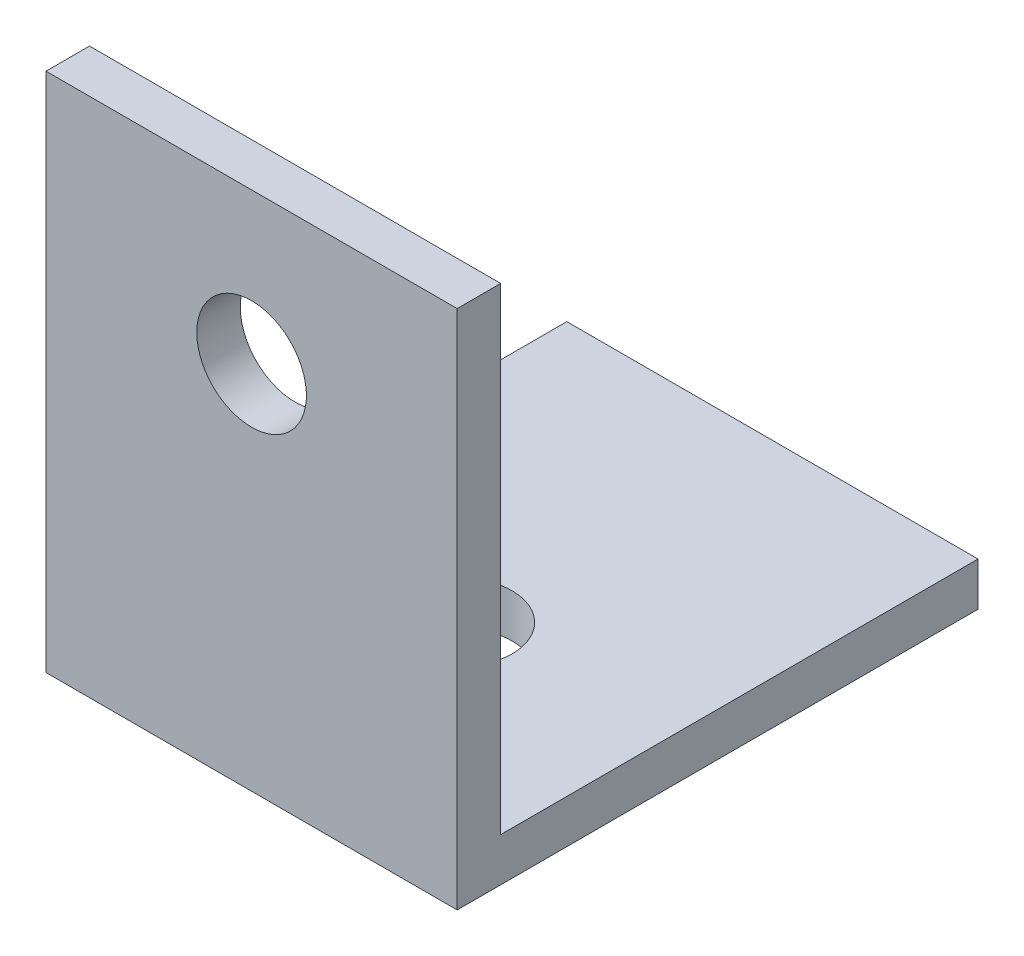
ISO-10303-21;
HEADER;
FILE_DESCRIPTION(('STEP AP214'),'2;1');
FILE_NAME('part.step','',(''),(''),'','','');
FILE_SCHEMA(('AUTOMOTIVE_DESIGN { 1 0 10303 214 1 1 1 1 }'));
ENDSEC;
DATA;
#1=APPLICATION_CONTEXT('core data for automotive mechanical design processes');
#2=APPLICATION_PROTOCOL_DEFINITION('international standard','automotive_design',2000,#1);
#3=PRODUCT_CONTEXT('',#1,'mechanical');
#4=PRODUCT('Part','Part','',(#3));
#5=PRODUCT_RELATED_PRODUCT_CATEGORY('part','',(#4));
#6=PRODUCT_DEFINITION_FORMATION('','',#4);
#7=PRODUCT_DEFINITION_CONTEXT('part definition',#1,'design');
#8=PRODUCT_DEFINITION('design','',#6,#7);
#9=PRODUCT_DEFINITION_SHAPE('','',#8);
#10=(LENGTH_UNIT() NAMED_UNIT(*) SI_UNIT(.MILLI.,.METRE.));
#11=(NAMED_UNIT(*) PLANE_ANGLE_UNIT() SI_UNIT($,.RADIAN.));
#12=(NAMED_UNIT(*) SI_UNIT($,.STERADIAN.) SOLID_ANGLE_UNIT());
#13=UNCERTAINTY_MEASURE_WITH_UNIT(LENGTH_MEASURE(1.E-05),#10,'distance_accuracy_value','');
#14=(GEOMETRIC_REPRESENTATION_CONTEXT(3) GLOBAL_UNCERTAINTY_ASSIGNED_CONTEXT((#13)) GLOBAL_UNIT_ASSIGNED_CONTEXT((#10,
#11,#12)) REPRESENTATION_CONTEXT('',''));
#15=CARTESIAN_POINT('',(0.,0.,0.));
#16=DIRECTION('',(0.,0.,1.));
#17=DIRECTION('',(1.,0.,0.));
#18=AXIS2_PLACEMENT_3D('',#15,#16,#17);
#19=CARTESIAN_POINT('',(0.,0.,3.175));
#20=DIRECTION('',(1.,0.,0.));
#21=DIRECTION('',(0.,0.,-1.));
#22=AXIS2_PLACEMENT_3D('',#19,#20,#21);
#23=PLANE('',#22);
#24=DIRECTION('',(0.,-1.,0.));
#25=VECTOR('',#24,1.);
#26=CARTESIAN_POINT('',(0.,0.,0.));
#27=LINE('',#26,#25);
#28=CARTESIAN_POINT('',(0.,38.,0.));
#29=VERTEX_POINT('',#28);
#30=CARTESIAN_POINT('',(0.,3.175,0.));
#31=VERTEX_POINT('',#30);
#32=EDGE_CURVE('E131',#29,#31,#27,.T.);
#33=ORIENTED_EDGE('',*,*,#32,.T.);
#34=DIRECTION('',(0.,0.,1.));
#35=VECTOR('',#34,1.);
#36=CARTESIAN_POINT('',(0.,3.175,-34.825));
#37=LINE('',#36,#35);
#38=CARTESIAN_POINT('',(0.,3.175,-34.825));
#39=VERTEX_POINT('',#38);
#40=EDGE_CURVE('E128',#39,#31,#37,.T.);
#41=ORIENTED_EDGE('',*,*,#40,.F.);
#42=DIRECTION('',(0.,1.,0.));
#43=VECTOR('',#42,1.);
#44=CARTESIAN_POINT('',(0.,0.,-34.825));
#45=LINE('',#44,#43);
#46=CARTESIAN_POINT('',(0.,0.,-34.825));
#47=VERTEX_POINT('',#46);
#48=EDGE_CURVE('E111',#47,#39,#45,.T.);
#49=ORIENTED_EDGE('',*,*,#48,.F.);
#50=DIRECTION('',(0.,0.,-1.));
#51=VECTOR('',#50,1.);
#52=CARTESIAN_POINT('',(0.,0.,3.175));
#53=LINE('',#52,#51);
#54=CARTESIAN_POINT('',(0.,0.,3.175));
#55=VERTEX_POINT('',#54);
#56=EDGE_CURVE('E11',#55,#47,#53,.T.);
#57=ORIENTED_EDGE('',*,*,#56,.F.);
#58=DIRECTION('',(0.,-1.,0.));
#59=VECTOR('',#58,1.);
#60=CARTESIAN_POINT('',(0.,0.,3.175));
#61=LINE('',#60,#59);
#62=CARTESIAN_POINT('',(0.,38.,3.175));
#63=VERTEX_POINT('',#62);
#64=EDGE_CURVE('E132',#63,#55,#61,.T.);
#65=ORIENTED_EDGE('',*,*,#64,.F.);
#66=DIRECTION('',(0.,0.,-1.));
#67=VECTOR('',#66,1.);
#68=CARTESIAN_POINT('',(0.,38.,3.175));
#69=LINE('',#68,#67);
#70=EDGE_CURVE('E137',#63,#29,#69,.T.);
#71=ORIENTED_EDGE('',*,*,#70,.T.);
#72=EDGE_LOOP('',(#33,#41,#49,#57,#65,#71));
#73=FACE_BOUND('',#72,.T.);
#74=ADVANCED_FACE('F36',(#73),#23,.F.);
#75=CARTESIAN_POINT('',(0.,0.,3.175));
#76=DIRECTION('',(0.,1.,0.));
#77=DIRECTION('',(0.,0.,1.));
#78=AXIS2_PLACEMENT_3D('',#75,#76,#77);
#79=PLANE('',#78);
#80=CARTESIAN_POINT('',(15.,0.,-11.825));
#81=DIRECTION('',(0.,1.,0.));
#82=DIRECTION('',(-1.,0.,0.));
#83=AXIS2_PLACEMENT_3D('',#80,#81,#82);
#84=CIRCLE('',#83,4.);
#85=CARTESIAN_POINT('',(11.,0.,-11.825));
#86=VERTEX_POINT('',#85);
#87=EDGE_CURVE('E184',#86,#86,#84,.T.);
#88=ORIENTED_EDGE('',*,*,#87,.T.);
#89=EDGE_LOOP('',(#88));
#90=FACE_BOUND('',#89,.T.);
#91=ORIENTED_EDGE('',*,*,#56,.T.);
#92=DIRECTION('',(-1.,0.,0.));
#93=VECTOR('',#92,1.);
#94=CARTESIAN_POINT('',(30.,0.,-34.825));
#95=LINE('',#94,#93);
#96=CARTESIAN_POINT('',(30.,0.,-34.825));
#97=VERTEX_POINT('',#96);
#98=EDGE_CURVE('E106',#97,#47,#95,.T.);
#99=ORIENTED_EDGE('',*,*,#98,.F.);
#100=DIRECTION('',(0.,0.,-1.));
#101=VECTOR('',#100,1.);
#102=CARTESIAN_POINT('',(30.,0.,3.175));
#103=LINE('',#102,#101);
#104=CARTESIAN_POINT('',(30.,0.,3.175));
#105=VERTEX_POINT('',#104);
#106=EDGE_CURVE('E43',#105,#97,#103,.T.);
#107=ORIENTED_EDGE('',*,*,#106,.F.);
#108=DIRECTION('',(1.,0.,0.));
#109=VECTOR('',#108,1.);
#110=CARTESIAN_POINT('',(0.,0.,3.175));
#111=LINE('',#110,#109);
#112=EDGE_CURVE('E81',#55,#105,#111,.T.);
#113=ORIENTED_EDGE('',*,*,#112,.F.);
#114=EDGE_LOOP('',(#91,#99,#107,#113));
#115=FACE_BOUND('',#114,.T.);
#116=ADVANCED_FACE('F107',(#90,#115),#79,.F.);
#117=CARTESIAN_POINT('',(30.,0.,3.175));
#118=DIRECTION('',(-1.,0.,0.));
#119=DIRECTION('',(0.,0.,1.));
#120=AXIS2_PLACEMENT_3D('',#117,#118,#119);
#121=PLANE('',#120);
#122=ORIENTED_EDGE('',*,*,#106,.T.);
#123=DIRECTION('',(0.,-1.,0.));
#124=VECTOR('',#123,1.);
#125=CARTESIAN_POINT('',(30.,0.,-34.825));
#126=LINE('',#125,#124);
#127=CARTESIAN_POINT('',(30.,3.175,-34.825));
#128=VERTEX_POINT('',#127);
#129=EDGE_CURVE('E101',#128,#97,#126,.T.);
#130=ORIENTED_EDGE('',*,*,#129,.F.);
#131=DIRECTION('',(0.,0.,1.));
#132=VECTOR('',#131,1.);
#133=CARTESIAN_POINT('',(30.,3.175,-34.825));
#134=LINE('',#133,#132);
#135=CARTESIAN_POINT('',(30.,3.175,0.));
#136=VERTEX_POINT('',#135);
#137=EDGE_CURVE('E125',#128,#136,#134,.T.);
#138=ORIENTED_EDGE('',*,*,#137,.T.);
#139=DIRECTION('',(0.,1.,0.));
#140=VECTOR('',#139,1.);
#141=CARTESIAN_POINT('',(30.,0.,0.));
#142=LINE('',#141,#140);
#143=CARTESIAN_POINT('',(30.,38.,0.));
#144=VERTEX_POINT('',#143);
#145=EDGE_CURVE('E139',#136,#144,#142,.T.);
#146=ORIENTED_EDGE('',*,*,#145,.T.);
#147=DIRECTION('',(0.,0.,-1.));
#148=VECTOR('',#147,1.);
#149=CARTESIAN_POINT('',(30.,38.,3.175));
#150=LINE('',#149,#148);
#151=CARTESIAN_POINT('',(30.,38.,3.175));
#152=VERTEX_POINT('',#151);
#153=EDGE_CURVE('E104',#152,#144,#150,.T.);
#154=ORIENTED_EDGE('',*,*,#153,.F.);
#155=DIRECTION('',(0.,1.,0.));
#156=VECTOR('',#155,1.);
#157=CARTESIAN_POINT('',(30.,0.,3.175));
#158=LINE('',#157,#156);
#159=EDGE_CURVE('E103',#105,#152,#158,.T.);
#160=ORIENTED_EDGE('',*,*,#159,.F.);
#161=EDGE_LOOP('',(#122,#130,#138,#146,#154,#160));
#162=FACE_BOUND('',#161,.T.);
#163=ADVANCED_FACE('F98',(#162),#121,.F.);
#164=CARTESIAN_POINT('',(0.,38.,3.175));
#165=DIRECTION('',(0.,-1.,0.));
#166=DIRECTION('',(0.,0.,-1.));
#167=AXIS2_PLACEMENT_3D('',#164,#165,#166);
#168=PLANE('',#167);
#169=DIRECTION('',(-1.,0.,0.));
#170=VECTOR('',#169,1.);
#171=CARTESIAN_POINT('',(0.,38.,0.));
#172=LINE('',#171,#170);
#173=EDGE_CURVE('E74',#144,#29,#172,.T.);
#174=ORIENTED_EDGE('',*,*,#173,.T.);
#175=ORIENTED_EDGE('',*,*,#70,.F.);
#176=DIRECTION('',(-1.,0.,0.));
#177=VECTOR('',#176,1.);
#178=CARTESIAN_POINT('',(0.,38.,3.175));
#179=LINE('',#178,#177);
#180=EDGE_CURVE('E59',#152,#63,#179,.T.);
#181=ORIENTED_EDGE('',*,*,#180,.F.);
#182=ORIENTED_EDGE('',*,*,#153,.T.);
#183=EDGE_LOOP('',(#174,#175,#181,#182));
#184=FACE_BOUND('',#183,.T.);
#185=ADVANCED_FACE('F143',(#184),#168,.F.);
#186=CARTESIAN_POINT('',(0.,0.,3.175));
#187=DIRECTION('',(0.,0.,-1.));
#188=DIRECTION('',(-1.,0.,0.));
#189=AXIS2_PLACEMENT_3D('',#186,#187,#188);
#190=PLANE('',#189);
#191=CARTESIAN_POINT('',(15.,27.,3.175));
#192=DIRECTION('',(0.,0.,-1.));
#193=DIRECTION('',(-1.,0.,0.));
#194=AXIS2_PLACEMENT_3D('',#191,#192,#193);
#195=CIRCLE('',#194,4.);
#196=CARTESIAN_POINT('',(11.,27.,3.175));
#197=VERTEX_POINT('',#196);
#198=EDGE_CURVE('E118',#197,#197,#195,.T.);
#199=ORIENTED_EDGE('',*,*,#198,.T.);
#200=EDGE_LOOP('',(#199));
#201=FACE_BOUND('',#200,.T.);
#202=ORIENTED_EDGE('',*,*,#64,.T.);
#203=ORIENTED_EDGE('',*,*,#112,.T.);
#204=ORIENTED_EDGE('',*,*,#159,.T.);
#205=ORIENTED_EDGE('',*,*,#180,.T.);
#206=EDGE_LOOP('',(#202,#203,#204,#205));
#207=FACE_BOUND('',#206,.T.);
#208=ADVANCED_FACE('F159',(#201,#207),#190,.F.);
#209=CARTESIAN_POINT('',(0.,0.,0.));
#210=DIRECTION('',(0.,0.,-1.));
#211=DIRECTION('',(-1.,0.,0.));
#212=AXIS2_PLACEMENT_3D('',#209,#210,#211);
#213=PLANE('',#212);
#214=CARTESIAN_POINT('',(15.,27.,0.));
#215=DIRECTION('',(0.,0.,-1.));
#216=DIRECTION('',(-1.,0.,0.));
#217=AXIS2_PLACEMENT_3D('',#214,#215,#216);
#218=CIRCLE('',#217,4.);
#219=CARTESIAN_POINT('',(11.,27.,0.));
#220=VERTEX_POINT('',#219);
#221=EDGE_CURVE('E121',#220,#220,#218,.T.);
#222=ORIENTED_EDGE('',*,*,#221,.F.);
#223=EDGE_LOOP('',(#222));
#224=FACE_BOUND('',#223,.T.);
#225=DIRECTION('',(1.,0.,0.));
#226=VECTOR('',#225,1.);
#227=CARTESIAN_POINT('',(30.,3.175,0.));
#228=LINE('',#227,#226);
#229=EDGE_CURVE('E50',#31,#136,#228,.T.);
#230=ORIENTED_EDGE('',*,*,#229,.F.);
#231=ORIENTED_EDGE('',*,*,#32,.F.);
#232=ORIENTED_EDGE('',*,*,#173,.F.);
#233=ORIENTED_EDGE('',*,*,#145,.F.);
#234=EDGE_LOOP('',(#230,#231,#232,#233));
#235=FACE_BOUND('',#234,.T.);
#236=ADVANCED_FACE('F144',(#224,#235),#213,.T.);
#237=CARTESIAN_POINT('',(30.,3.175,-34.825));
#238=DIRECTION('',(0.,-1.,0.));
#239=DIRECTION('',(1.,0.,0.));
#240=AXIS2_PLACEMENT_3D('',#237,#238,#239);
#241=PLANE('',#240);
#242=CARTESIAN_POINT('',(15.,3.175,-11.825));
#243=DIRECTION('',(0.,1.,0.));
#244=DIRECTION('',(-1.,0.,0.));
#245=AXIS2_PLACEMENT_3D('',#242,#243,#244);
#246=CIRCLE('',#245,4.);
#247=CARTESIAN_POINT('',(11.,3.175,-11.825));
#248=VERTEX_POINT('',#247);
#249=EDGE_CURVE('E186',#248,#248,#246,.T.);
#250=ORIENTED_EDGE('',*,*,#249,.F.);
#251=EDGE_LOOP('',(#250));
#252=FACE_BOUND('',#251,.T.);
#253=ORIENTED_EDGE('',*,*,#229,.T.);
#254=ORIENTED_EDGE('',*,*,#137,.F.);
#255=DIRECTION('',(1.,0.,0.));
#256=VECTOR('',#255,1.);
#257=CARTESIAN_POINT('',(30.,3.175,-34.825));
#258=LINE('',#257,#256);
#259=EDGE_CURVE('E115',#39,#128,#258,.T.);
#260=ORIENTED_EDGE('',*,*,#259,.F.);
#261=ORIENTED_EDGE('',*,*,#40,.T.);
#262=EDGE_LOOP('',(#253,#254,#260,#261));
#263=FACE_BOUND('',#262,.T.);
#264=ADVANCED_FACE('F149',(#252,#263),#241,.F.);
#265=CARTESIAN_POINT('',(0.,0.,-34.825));
#266=DIRECTION('',(0.,0.,1.));
#267=DIRECTION('',(1.,0.,0.));
#268=AXIS2_PLACEMENT_3D('',#265,#266,#267);
#269=PLANE('',#268);
#270=ORIENTED_EDGE('',*,*,#129,.T.);
#271=ORIENTED_EDGE('',*,*,#98,.T.);
#272=ORIENTED_EDGE('',*,*,#48,.T.);
#273=ORIENTED_EDGE('',*,*,#259,.T.);
#274=EDGE_LOOP('',(#270,#271,#272,#273));
#275=FACE_BOUND('',#274,.T.);
#276=ADVANCED_FACE('F113',(#275),#269,.F.);
#277=CARTESIAN_POINT('',(15.,27.,3.175));
#278=DIRECTION('',(0.,0.,-1.));
#279=DIRECTION('',(-1.,0.,0.));
#280=AXIS2_PLACEMENT_3D('',#277,#278,#279);
#281=CYLINDRICAL_SURFACE('',#280,4.);
#282=ORIENTED_EDGE('',*,*,#198,.F.);
#283=EDGE_LOOP('',(#282));
#284=FACE_BOUND('',#283,.T.);
#285=ORIENTED_EDGE('',*,*,#221,.T.);
#286=EDGE_LOOP('',(#285));
#287=FACE_BOUND('',#286,.T.);
#288=ADVANCED_FACE('F157',(#284,#287),#281,.F.);
#289=CARTESIAN_POINT('',(15.,0.,-11.825));
#290=DIRECTION('',(0.,1.,0.));
#291=DIRECTION('',(-1.,0.,0.));
#292=AXIS2_PLACEMENT_3D('',#289,#290,#291);
#293=CYLINDRICAL_SURFACE('',#292,4.);
#294=ORIENTED_EDGE('',*,*,#87,.F.);
#295=EDGE_LOOP('',(#294));
#296=FACE_BOUND('',#295,.T.);
#297=ORIENTED_EDGE('',*,*,#249,.T.);
#298=EDGE_LOOP('',(#297));
#299=FACE_BOUND('',#298,.T.);
#300=ADVANCED_FACE('F191',(#296,#299),#293,.F.);
#301=CLOSED_SHELL('',(#74,#116,#163,#185,#208,#236,#264,#276,#288,#300));
#302=MANIFOLD_SOLID_BREP('B2',#301);
#303=ADVANCED_BREP_SHAPE_REPRESENTATION('',(#18,#302),#14);
#304=SHAPE_DEFINITION_REPRESENTATION(#9,#303);
ENDSEC;
END-ISO-10303-21;
